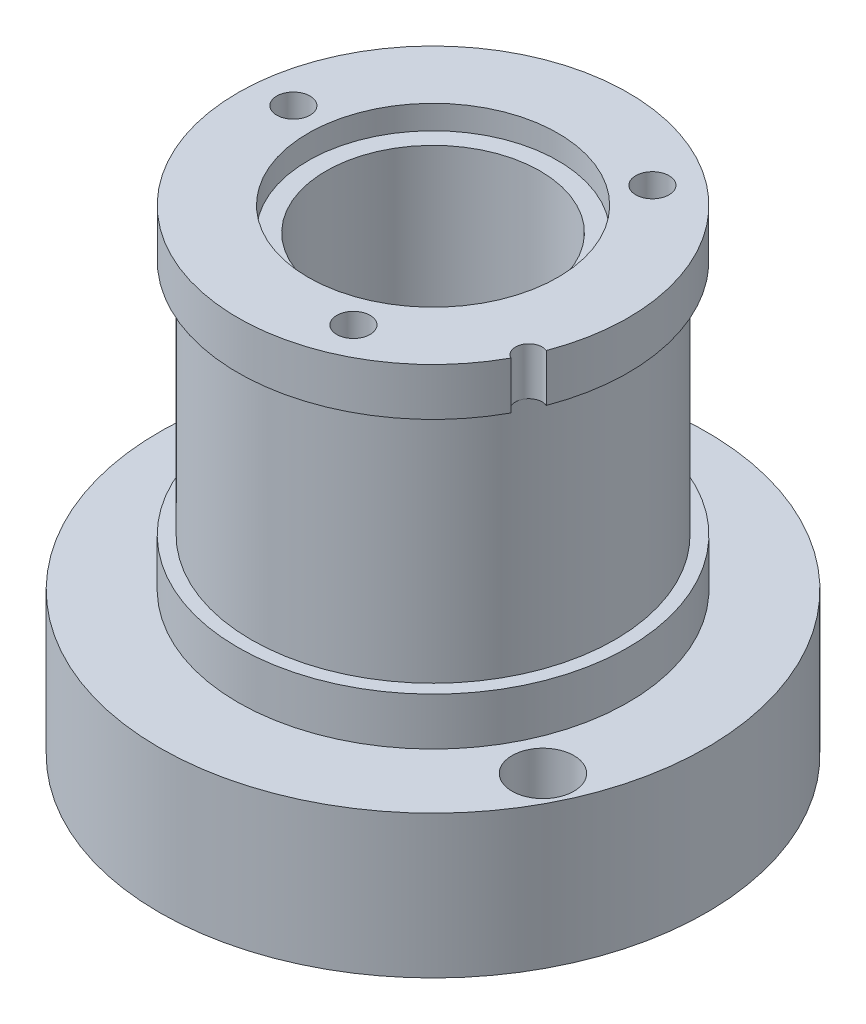
ISO-10303-21;
HEADER;
FILE_DESCRIPTION(('STEP AP214'),'2;1');
FILE_NAME('part.step','',(''),(''),'','','');
FILE_SCHEMA(('AUTOMOTIVE_DESIGN { 1 0 10303 214 1 1 1 1 }'));
ENDSEC;
DATA;
#1=APPLICATION_CONTEXT('core data for automotive mechanical design processes');
#2=APPLICATION_PROTOCOL_DEFINITION('international standard','automotive_design',2000,#1);
#3=PRODUCT_CONTEXT('',#1,'mechanical');
#4=PRODUCT('Part','Part','',(#3));
#5=PRODUCT_RELATED_PRODUCT_CATEGORY('part','',(#4));
#6=PRODUCT_DEFINITION_FORMATION('','',#4);
#7=PRODUCT_DEFINITION_CONTEXT('part definition',#1,'design');
#8=PRODUCT_DEFINITION('design','',#6,#7);
#9=PRODUCT_DEFINITION_SHAPE('','',#8);
#10=(LENGTH_UNIT() NAMED_UNIT(*) SI_UNIT(.MILLI.,.METRE.));
#11=(NAMED_UNIT(*) PLANE_ANGLE_UNIT() SI_UNIT($,.RADIAN.));
#12=(NAMED_UNIT(*) SI_UNIT($,.STERADIAN.) SOLID_ANGLE_UNIT());
#13=UNCERTAINTY_MEASURE_WITH_UNIT(LENGTH_MEASURE(1.E-05),#10,'distance_accuracy_value','');
#14=(GEOMETRIC_REPRESENTATION_CONTEXT(3) GLOBAL_UNCERTAINTY_ASSIGNED_CONTEXT((#13)) GLOBAL_UNIT_ASSIGNED_CONTEXT((#10,
#11,#12)) REPRESENTATION_CONTEXT('',''));
#15=CARTESIAN_POINT('',(0.,0.,0.));
#16=DIRECTION('',(0.,0.,1.));
#17=DIRECTION('',(1.,0.,0.));
#18=AXIS2_PLACEMENT_3D('',#15,#16,#17);
#19=CARTESIAN_POINT('',(13.0281539228037,7.62,14.3830452707903));
#20=DIRECTION('',(0.,1.,0.));
#21=DIRECTION('',(0.,0.,1.));
#22=AXIS2_PLACEMENT_3D('',#19,#20,#21);
#23=PLANE('',#22);
#24=CARTESIAN_POINT('',(13.0281539228037,7.62,14.3830452707903));
#25=DIRECTION('',(0.,1.,0.));
#26=DIRECTION('',(0.,0.,1.));
#27=AXIS2_PLACEMENT_3D('',#24,#25,#26);
#28=CIRCLE('',#27,14.605);
#29=CARTESIAN_POINT('',(13.0281539228037,7.62,28.9880452707903));
#30=VERTEX_POINT('',#29);
#31=EDGE_CURVE('E111',#30,#30,#28,.T.);
#32=ORIENTED_EDGE('',*,*,#31,.T.);
#33=EDGE_LOOP('',(#32));
#34=FACE_BOUND('',#33,.T.);
#35=CARTESIAN_POINT('',(1.60675446587194,7.62,8.82952076420888));
#36=DIRECTION('',(0.,1.,0.));
#37=DIRECTION('',(0.,0.,1.));
#38=AXIS2_PLACEMENT_3D('',#35,#36,#37);
#39=CIRCLE('',#38,1.651);
#40=CARTESIAN_POINT('',(1.60675446587194,7.62,7.17852076420888));
#41=VERTEX_POINT('',#40);
#42=EDGE_CURVE('E131',#41,#41,#39,.T.);
#43=ORIENTED_EDGE('',*,*,#42,.F.);
#44=EDGE_LOOP('',(#43));
#45=FACE_BOUND('',#44,.T.);
#46=CARTESIAN_POINT('',(24.4495533797354,7.62,19.9365697773716));
#47=DIRECTION('',(0.,1.,0.));
#48=DIRECTION('',(0.,0.,1.));
#49=AXIS2_PLACEMENT_3D('',#46,#47,#48);
#50=CIRCLE('',#49,1.651);
#51=CARTESIAN_POINT('',(24.4495533797354,7.62,18.2855697773716));
#52=VERTEX_POINT('',#51);
#53=EDGE_CURVE('E45',#52,#52,#50,.T.);
#54=ORIENTED_EDGE('',*,*,#53,.F.);
#55=EDGE_LOOP('',(#54));
#56=FACE_BOUND('',#55,.T.);
#57=CARTESIAN_POINT('',(13.0281539228037,7.62,14.3830452707903));
#58=DIRECTION('',(0.,1.,0.));
#59=DIRECTION('',(0.,0.,1.));
#60=AXIS2_PLACEMENT_3D('',#57,#58,#59);
#61=CIRCLE('',#60,10.414);
#62=CARTESIAN_POINT('',(13.0281539228037,7.62,24.7970452707903));
#63=VERTEX_POINT('',#62);
#64=EDGE_CURVE('E475',#63,#63,#61,.T.);
#65=ORIENTED_EDGE('',*,*,#64,.F.);
#66=EDGE_LOOP('',(#65));
#67=FACE_BOUND('',#66,.T.);
#68=ADVANCED_FACE('F41',(#34,#45,#56,#67),#23,.T.);
#69=CARTESIAN_POINT('',(13.0281539228037,25.4,14.3830452707903));
#70=DIRECTION('',(0.,-1.,0.));
#71=DIRECTION('',(0.,0.,-1.));
#72=AXIS2_PLACEMENT_3D('',#69,#70,#71);
#73=CYLINDRICAL_SURFACE('',#72,14.605);
#74=CARTESIAN_POINT('',(13.0281539228037,0.,14.3830452707903));
#75=DIRECTION('',(0.,1.,0.));
#76=DIRECTION('',(0.,0.,1.));
#77=AXIS2_PLACEMENT_3D('',#74,#75,#76);
#78=CIRCLE('',#77,14.605);
#79=CARTESIAN_POINT('',(13.0281539228037,0.,28.9880452707903));
#80=VERTEX_POINT('',#79);
#81=EDGE_CURVE('E12',#80,#80,#78,.T.);
#82=ORIENTED_EDGE('',*,*,#81,.T.);
#83=EDGE_LOOP('',(#82));
#84=FACE_BOUND('',#83,.T.);
#85=ORIENTED_EDGE('',*,*,#31,.F.);
#86=EDGE_LOOP('',(#85));
#87=FACE_BOUND('',#86,.T.);
#88=ADVANCED_FACE('F43',(#84,#87),#73,.T.);
#89=CARTESIAN_POINT('',(13.0281539228037,25.4,14.3830452707903));
#90=DIRECTION('',(0.,1.,0.));
#91=DIRECTION('',(0.,0.,1.));
#92=AXIS2_PLACEMENT_3D('',#89,#90,#91);
#93=PLANE('',#92);
#94=CARTESIAN_POINT('',(22.4903320136348,25.4,18.7325948770593));
#95=DIRECTION('',(0.,1.,0.));
#96=DIRECTION('',(0.,0.,1.));
#97=AXIS2_PLACEMENT_3D('',#94,#95,#96);
#98=CIRCLE('',#97,0.711199999999998);
#99=CARTESIAN_POINT('',(22.7651359221512,25.4,18.0766312714652));
#100=VERTEX_POINT('',#99);
#101=CARTESIAN_POINT('',(22.17139754222,25.4,19.3682726593857));
#102=VERTEX_POINT('',#101);
#103=EDGE_CURVE('E94',#100,#102,#98,.T.);
#104=ORIENTED_EDGE('',*,*,#103,.F.);
#105=CARTESIAN_POINT('',(13.0281539228037,25.4,14.3830452707903));
#106=DIRECTION('',(0.,1.,0.));
#107=DIRECTION('',(0.,0.,1.));
#108=AXIS2_PLACEMENT_3D('',#105,#106,#107);
#109=CIRCLE('',#108,10.414);
#110=EDGE_CURVE('E107',#100,#102,#109,.T.);
#111=ORIENTED_EDGE('',*,*,#110,.T.);
#112=EDGE_LOOP('',(#104,#111));
#113=FACE_BOUND('',#112,.T.);
#114=CARTESIAN_POINT('',(16.4348390463682,25.4,22.0415320971081));
#115=DIRECTION('',(0.,1.,0.));
#116=DIRECTION('',(0.,0.,1.));
#117=AXIS2_PLACEMENT_3D('',#114,#115,#116);
#118=CIRCLE('',#117,0.889000000000001);
#119=CARTESIAN_POINT('',(16.4348390463682,25.4,22.9305320971081));
#120=VERTEX_POINT('',#119);
#121=EDGE_CURVE('E157',#120,#120,#118,.T.);
#122=ORIENTED_EDGE('',*,*,#121,.F.);
#123=EDGE_LOOP('',(#122));
#124=FACE_BOUND('',#123,.T.);
#125=CARTESIAN_POINT('',(17.9572555071611,25.4,7.60352599792991));
#126=DIRECTION('',(0.,1.,0.));
#127=DIRECTION('',(0.,0.,1.));
#128=AXIS2_PLACEMENT_3D('',#125,#126,#127);
#129=CIRCLE('',#128,0.889000000000001);
#130=CARTESIAN_POINT('',(17.9572555071611,25.4,8.49252599792991));
#131=VERTEX_POINT('',#130);
#132=EDGE_CURVE('E163',#131,#131,#129,.T.);
#133=ORIENTED_EDGE('',*,*,#132,.F.);
#134=EDGE_LOOP('',(#133));
#135=FACE_BOUND('',#134,.T.);
#136=CARTESIAN_POINT('',(4.69236721488166,25.4,13.5040777173328));
#137=DIRECTION('',(0.,1.,0.));
#138=DIRECTION('',(0.,0.,1.));
#139=AXIS2_PLACEMENT_3D('',#136,#137,#138);
#140=CIRCLE('',#139,0.889);
#141=CARTESIAN_POINT('',(4.69236721488166,25.4,14.3930777173328));
#142=VERTEX_POINT('',#141);
#143=EDGE_CURVE('E118',#142,#142,#140,.T.);
#144=ORIENTED_EDGE('',*,*,#143,.F.);
#145=EDGE_LOOP('',(#144));
#146=FACE_BOUND('',#145,.T.);
#147=CARTESIAN_POINT('',(13.0281539228037,25.4,14.3830452707903));
#148=DIRECTION('',(0.,1.,0.));
#149=DIRECTION('',(0.,0.,1.));
#150=AXIS2_PLACEMENT_3D('',#147,#148,#149);
#151=CIRCLE('',#150,6.6675);
#152=CARTESIAN_POINT('',(13.0281539228037,25.4,21.0505452707903));
#153=VERTEX_POINT('',#152);
#154=EDGE_CURVE('E115',#153,#153,#151,.T.);
#155=ORIENTED_EDGE('',*,*,#154,.F.);
#156=EDGE_LOOP('',(#155));
#157=FACE_BOUND('',#156,.T.);
#158=ADVANCED_FACE('F105',(#113,#124,#135,#146,#157),#93,.T.);
#159=CARTESIAN_POINT('',(13.0281539228037,0.,14.3830452707903));
#160=DIRECTION('',(0.,1.,0.));
#161=DIRECTION('',(0.,0.,1.));
#162=AXIS2_PLACEMENT_3D('',#159,#160,#161);
#163=CYLINDRICAL_SURFACE('',#162,5.715);
#164=CARTESIAN_POINT('',(13.0281539228037,0.,14.3830452707903));
#165=DIRECTION('',(0.,1.,0.));
#166=DIRECTION('',(0.,0.,1.));
#167=AXIS2_PLACEMENT_3D('',#164,#165,#166);
#168=CIRCLE('',#167,5.715);
#169=CARTESIAN_POINT('',(13.0281539228037,0.,20.0980452707903));
#170=VERTEX_POINT('',#169);
#171=EDGE_CURVE('E50',#170,#170,#168,.T.);
#172=ORIENTED_EDGE('',*,*,#171,.F.);
#173=EDGE_LOOP('',(#172));
#174=FACE_BOUND('',#173,.T.);
#175=CARTESIAN_POINT('',(13.0281539228037,24.13,14.3830452707903));
#176=DIRECTION('',(0.,1.,0.));
#177=DIRECTION('',(0.,0.,1.));
#178=AXIS2_PLACEMENT_3D('',#175,#176,#177);
#179=CIRCLE('',#178,5.715);
#180=CARTESIAN_POINT('',(13.0281539228037,24.13,20.0980452707903));
#181=VERTEX_POINT('',#180);
#182=EDGE_CURVE('E125',#181,#181,#179,.F.);
#183=ORIENTED_EDGE('',*,*,#182,.F.);
#184=EDGE_LOOP('',(#183));
#185=FACE_BOUND('',#184,.T.);
#186=ADVANCED_FACE('F175',(#174,#185),#163,.F.);
#187=CARTESIAN_POINT('',(13.0281539228037,0.,14.3830452707903));
#188=DIRECTION('',(0.,1.,0.));
#189=DIRECTION('',(0.,0.,1.));
#190=AXIS2_PLACEMENT_3D('',#187,#188,#189);
#191=PLANE('',#190);
#192=CARTESIAN_POINT('',(5.82740256425499,0.,15.2376598659039));
#193=DIRECTION('',(0.,-1.,0.));
#194=DIRECTION('',(0.,0.,-1.));
#195=AXIS2_PLACEMENT_3D('',#192,#193,#194);
#196=CIRCLE('',#195,0.595629999999989);
#197=CARTESIAN_POINT('',(5.82740256425499,0.,14.6420298659039));
#198=VERTEX_POINT('',#197);
#199=EDGE_CURVE('E428',#198,#198,#196,.T.);
#200=ORIENTED_EDGE('',*,*,#199,.F.);
#201=EDGE_LOOP('',(#200));
#202=FACE_BOUND('',#201,.T.);
#203=CARTESIAN_POINT('',(5.82740256425499,0.,19.0476598659039));
#204=DIRECTION('',(0.,-1.,0.));
#205=DIRECTION('',(0.,0.,-1.));
#206=AXIS2_PLACEMENT_3D('',#203,#204,#205);
#207=CIRCLE('',#206,0.595629999999989);
#208=CARTESIAN_POINT('',(5.82740256425499,0.,18.4520298659039));
#209=VERTEX_POINT('',#208);
#210=EDGE_CURVE('E432',#209,#209,#207,.T.);
#211=ORIENTED_EDGE('',*,*,#210,.F.);
#212=EDGE_LOOP('',(#211));
#213=FACE_BOUND('',#212,.T.);
#214=CARTESIAN_POINT('',(5.82740256425499,0.,17.1426598659039));
#215=DIRECTION('',(0.,-1.,0.));
#216=DIRECTION('',(0.,0.,-1.));
#217=AXIS2_PLACEMENT_3D('',#214,#215,#216);
#218=CIRCLE('',#217,0.79375);
#219=CARTESIAN_POINT('',(5.82740256425499,0.,16.3489098659039));
#220=VERTEX_POINT('',#219);
#221=EDGE_CURVE('E436',#220,#220,#218,.T.);
#222=ORIENTED_EDGE('',*,*,#221,.F.);
#223=EDGE_LOOP('',(#222));
#224=FACE_BOUND('',#223,.T.);
#225=CARTESIAN_POINT('',(24.4495533797354,0.,19.9365697773716));
#226=DIRECTION('',(0.,-1.,0.));
#227=DIRECTION('',(0.,0.,1.));
#228=AXIS2_PLACEMENT_3D('',#225,#226,#227);
#229=CIRCLE('',#228,1.651);
#230=CARTESIAN_POINT('',(24.4495533797354,0.,18.2855697773716));
#231=VERTEX_POINT('',#230);
#232=EDGE_CURVE('E145',#231,#231,#229,.T.);
#233=ORIENTED_EDGE('',*,*,#232,.F.);
#234=EDGE_LOOP('',(#233));
#235=FACE_BOUND('',#234,.T.);
#236=CARTESIAN_POINT('',(1.60675446587194,0.,8.82952076420888));
#237=DIRECTION('',(0.,-1.,0.));
#238=DIRECTION('',(0.,0.,-1.));
#239=AXIS2_PLACEMENT_3D('',#236,#237,#238);
#240=CIRCLE('',#239,1.651);
#241=CARTESIAN_POINT('',(1.60675446587194,0.,7.17852076420888));
#242=VERTEX_POINT('',#241);
#243=EDGE_CURVE('E134',#242,#242,#240,.T.);
#244=ORIENTED_EDGE('',*,*,#243,.F.);
#245=EDGE_LOOP('',(#244));
#246=FACE_BOUND('',#245,.T.);
#247=CARTESIAN_POINT('',(17.8930413905689,0.,4.37789934651808));
#248=DIRECTION('',(0.,-1.,0.));
#249=DIRECTION('',(0.,0.,-1.));
#250=AXIS2_PLACEMENT_3D('',#247,#248,#249);
#251=CIRCLE('',#250,0.793749999999999);
#252=CARTESIAN_POINT('',(17.8930413905689,0.,3.58414934651808));
#253=VERTEX_POINT('',#252);
#254=EDGE_CURVE('E133',#253,#253,#251,.T.);
#255=ORIENTED_EDGE('',*,*,#254,.F.);
#256=EDGE_LOOP('',(#255));
#257=FACE_BOUND('',#256,.T.);
#258=CARTESIAN_POINT('',(8.16326645503836,0.,24.3881911950625));
#259=DIRECTION('',(0.,-1.,0.));
#260=DIRECTION('',(0.,0.,-1.));
#261=AXIS2_PLACEMENT_3D('',#258,#259,#260);
#262=CIRCLE('',#261,0.793749999999999);
#263=CARTESIAN_POINT('',(8.16326645503836,0.,23.5944411950625));
#264=VERTEX_POINT('',#263);
#265=EDGE_CURVE('E151',#264,#264,#262,.T.);
#266=ORIENTED_EDGE('',*,*,#265,.F.);
#267=EDGE_LOOP('',(#266));
#268=FACE_BOUND('',#267,.T.);
#269=ORIENTED_EDGE('',*,*,#171,.T.);
#270=EDGE_LOOP('',(#269));
#271=FACE_BOUND('',#270,.T.);
#272=ORIENTED_EDGE('',*,*,#81,.F.);
#273=EDGE_LOOP('',(#272));
#274=FACE_BOUND('',#273,.T.);
#275=ADVANCED_FACE('F190',(#202,#213,#224,#235,#246,#257,#268,#271,#274),#191,.F.);
#276=CARTESIAN_POINT('',(13.0281539228037,24.13,14.3830452707903));
#277=DIRECTION('',(0.,1.,0.));
#278=DIRECTION('',(0.,0.,1.));
#279=AXIS2_PLACEMENT_3D('',#276,#277,#278);
#280=PLANE('',#279);
#281=CARTESIAN_POINT('',(13.0281539228037,24.13,14.3830452707903));
#282=DIRECTION('',(0.,1.,0.));
#283=DIRECTION('',(0.,0.,1.));
#284=AXIS2_PLACEMENT_3D('',#281,#282,#283);
#285=CIRCLE('',#284,6.6675);
#286=CARTESIAN_POINT('',(13.0281539228037,24.13,21.0505452707903));
#287=VERTEX_POINT('',#286);
#288=EDGE_CURVE('E122',#287,#287,#285,.T.);
#289=ORIENTED_EDGE('',*,*,#288,.T.);
#290=EDGE_LOOP('',(#289));
#291=FACE_BOUND('',#290,.T.);
#292=ORIENTED_EDGE('',*,*,#182,.T.);
#293=EDGE_LOOP('',(#292));
#294=FACE_BOUND('',#293,.T.);
#295=ADVANCED_FACE('F181',(#291,#294),#280,.T.);
#296=CARTESIAN_POINT('',(13.0281539228037,24.13,14.3830452707903));
#297=DIRECTION('',(0.,1.,0.));
#298=DIRECTION('',(0.,0.,1.));
#299=AXIS2_PLACEMENT_3D('',#296,#297,#298);
#300=CYLINDRICAL_SURFACE('',#299,6.6675);
#301=ORIENTED_EDGE('',*,*,#288,.F.);
#302=EDGE_LOOP('',(#301));
#303=FACE_BOUND('',#302,.T.);
#304=ORIENTED_EDGE('',*,*,#154,.T.);
#305=EDGE_LOOP('',(#304));
#306=FACE_BOUND('',#305,.T.);
#307=ADVANCED_FACE('F179',(#303,#306),#300,.F.);
#308=CARTESIAN_POINT('',(13.0281539228037,7.62,14.3830452707903));
#309=DIRECTION('',(0.,1.,0.));
#310=DIRECTION('',(0.,0.,1.));
#311=AXIS2_PLACEMENT_3D('',#308,#309,#310);
#312=CYLINDRICAL_SURFACE('',#311,10.414);
#313=DIRECTION('',(0.,1.,0.));
#314=VECTOR('',#313,1.);
#315=CARTESIAN_POINT('',(22.7651359221512,23.622,18.0766312714652));
#316=LINE('',#315,#314);
#317=CARTESIAN_POINT('',(22.7651359221512,22.86,18.0766312714652));
#318=VERTEX_POINT('',#317);
#319=EDGE_CURVE('E91',#318,#100,#316,.T.);
#320=ORIENTED_EDGE('',*,*,#319,.F.);
#321=CARTESIAN_POINT('',(13.0281539228037,22.86,14.3830452707903));
#322=DIRECTION('',(0.,1.,0.));
#323=DIRECTION('',(0.,0.,1.));
#324=AXIS2_PLACEMENT_3D('',#321,#322,#323);
#325=CIRCLE('',#324,10.414);
#326=CARTESIAN_POINT('',(22.17139754222,22.86,19.3682726593857));
#327=VERTEX_POINT('',#326);
#328=EDGE_CURVE('E469',#318,#327,#325,.T.);
#329=ORIENTED_EDGE('',*,*,#328,.T.);
#330=DIRECTION('',(0.,1.,0.));
#331=VECTOR('',#330,1.);
#332=CARTESIAN_POINT('',(22.17139754222,23.622,19.3682726593857));
#333=LINE('',#332,#331);
#334=EDGE_CURVE('E58',#102,#327,#333,.F.);
#335=ORIENTED_EDGE('',*,*,#334,.F.);
#336=ORIENTED_EDGE('',*,*,#110,.F.);
#337=EDGE_LOOP('',(#320,#329,#335,#336));
#338=FACE_BOUND('',#337,.T.);
#339=ADVANCED_FACE('F110',(#338),#312,.T.);
#340=CARTESIAN_POINT('',(4.69236721488166,22.86,13.5040777173328));
#341=DIRECTION('',(0.,1.,0.));
#342=DIRECTION('',(0.,0.,1.));
#343=AXIS2_PLACEMENT_3D('',#340,#341,#342);
#344=CONICAL_SURFACE('',#343,0.888999999999999,1.02974425867665);
#345=CARTESIAN_POINT('',(4.69236721488166,22.3258349096845,13.5040777173328));
#346=VERTEX_POINT('',#345);
#347=VERTEX_LOOP('',#346);
#348=FACE_BOUND('',#347,.T.);
#349=CARTESIAN_POINT('',(4.69236721488166,22.86,13.5040777173328));
#350=DIRECTION('',(0.,1.,0.));
#351=DIRECTION('',(0.,0.,1.));
#352=AXIS2_PLACEMENT_3D('',#349,#350,#351);
#353=CIRCLE('',#352,0.888999999999999);
#354=CARTESIAN_POINT('',(4.69236721488166,22.86,14.3930777173328));
#355=VERTEX_POINT('',#354);
#356=EDGE_CURVE('E112',#355,#355,#353,.T.);
#357=ORIENTED_EDGE('',*,*,#356,.T.);
#358=EDGE_LOOP('',(#357));
#359=FACE_BOUND('',#358,.T.);
#360=ADVANCED_FACE('F188',(#348,#359),#344,.F.);
#361=CARTESIAN_POINT('',(4.69236721488166,25.4,13.5040777173328));
#362=DIRECTION('',(0.,1.,0.));
#363=DIRECTION('',(0.,0.,1.));
#364=AXIS2_PLACEMENT_3D('',#361,#362,#363);
#365=CYLINDRICAL_SURFACE('',#364,0.889);
#366=ORIENTED_EDGE('',*,*,#356,.F.);
#367=EDGE_LOOP('',(#366));
#368=FACE_BOUND('',#367,.T.);
#369=ORIENTED_EDGE('',*,*,#143,.T.);
#370=EDGE_LOOP('',(#369));
#371=FACE_BOUND('',#370,.T.);
#372=ADVANCED_FACE('F171',(#368,#371),#365,.F.);
#373=CARTESIAN_POINT('',(17.9572555071611,22.86,7.60352599792991));
#374=DIRECTION('',(0.,1.,0.));
#375=DIRECTION('',(0.,0.,1.));
#376=AXIS2_PLACEMENT_3D('',#373,#374,#375);
#377=CONICAL_SURFACE('',#376,0.889000000000001,1.02974425867665);
#378=CARTESIAN_POINT('',(17.9572555071611,22.3258349096845,7.60352599792991));
#379=VERTEX_POINT('',#378);
#380=VERTEX_LOOP('',#379);
#381=FACE_BOUND('',#380,.T.);
#382=CARTESIAN_POINT('',(17.9572555071611,22.86,7.60352599792991));
#383=DIRECTION('',(0.,1.,0.));
#384=DIRECTION('',(0.,0.,1.));
#385=AXIS2_PLACEMENT_3D('',#382,#383,#384);
#386=CIRCLE('',#385,0.889000000000001);
#387=CARTESIAN_POINT('',(17.9572555071611,22.86,8.49252599792991));
#388=VERTEX_POINT('',#387);
#389=EDGE_CURVE('E166',#388,#388,#386,.T.);
#390=ORIENTED_EDGE('',*,*,#389,.T.);
#391=EDGE_LOOP('',(#390));
#392=FACE_BOUND('',#391,.T.);
#393=ADVANCED_FACE('F208',(#381,#392),#377,.F.);
#394=CARTESIAN_POINT('',(17.9572555071611,25.4,7.60352599792991));
#395=DIRECTION('',(0.,1.,0.));
#396=DIRECTION('',(0.,0.,1.));
#397=AXIS2_PLACEMENT_3D('',#394,#395,#396);
#398=CYLINDRICAL_SURFACE('',#397,0.889000000000001);
#399=ORIENTED_EDGE('',*,*,#389,.F.);
#400=EDGE_LOOP('',(#399));
#401=FACE_BOUND('',#400,.T.);
#402=ORIENTED_EDGE('',*,*,#132,.T.);
#403=EDGE_LOOP('',(#402));
#404=FACE_BOUND('',#403,.T.);
#405=ADVANCED_FACE('F212',(#401,#404),#398,.F.);
#406=CARTESIAN_POINT('',(16.4348390463682,22.86,22.0415320971081));
#407=DIRECTION('',(0.,1.,0.));
#408=DIRECTION('',(0.,0.,1.));
#409=AXIS2_PLACEMENT_3D('',#406,#407,#408);
#410=CONICAL_SURFACE('',#409,0.889000000000001,1.02974425867665);
#411=CARTESIAN_POINT('',(16.4348390463682,22.3258349096845,22.0415320971081));
#412=VERTEX_POINT('',#411);
#413=VERTEX_LOOP('',#412);
#414=FACE_BOUND('',#413,.T.);
#415=CARTESIAN_POINT('',(16.4348390463682,22.86,22.0415320971081));
#416=DIRECTION('',(0.,1.,0.));
#417=DIRECTION('',(0.,0.,1.));
#418=AXIS2_PLACEMENT_3D('',#415,#416,#417);
#419=CIRCLE('',#418,0.889000000000001);
#420=CARTESIAN_POINT('',(16.4348390463682,22.86,22.9305320971081));
#421=VERTEX_POINT('',#420);
#422=EDGE_CURVE('E160',#421,#421,#419,.T.);
#423=ORIENTED_EDGE('',*,*,#422,.T.);
#424=EDGE_LOOP('',(#423));
#425=FACE_BOUND('',#424,.T.);
#426=ADVANCED_FACE('F216',(#414,#425),#410,.F.);
#427=CARTESIAN_POINT('',(16.4348390463682,25.4,22.0415320971081));
#428=DIRECTION('',(0.,1.,0.));
#429=DIRECTION('',(0.,0.,1.));
#430=AXIS2_PLACEMENT_3D('',#427,#428,#429);
#431=CYLINDRICAL_SURFACE('',#430,0.889000000000001);
#432=ORIENTED_EDGE('',*,*,#422,.F.);
#433=EDGE_LOOP('',(#432));
#434=FACE_BOUND('',#433,.T.);
#435=ORIENTED_EDGE('',*,*,#121,.T.);
#436=EDGE_LOOP('',(#435));
#437=FACE_BOUND('',#436,.T.);
#438=ADVANCED_FACE('F220',(#434,#437),#431,.F.);
#439=CARTESIAN_POINT('',(8.16326645503836,4.0005,24.3881911950625));
#440=DIRECTION('',(0.,-1.,0.));
#441=DIRECTION('',(0.,0.,-1.));
#442=AXIS2_PLACEMENT_3D('',#439,#440,#441);
#443=CONICAL_SURFACE('',#442,0.793749999999999,1.02974425867665);
#444=CARTESIAN_POINT('',(8.16326645503836,4.47743311635313,24.3881911950625));
#445=VERTEX_POINT('',#444);
#446=VERTEX_LOOP('',#445);
#447=FACE_BOUND('',#446,.T.);
#448=CARTESIAN_POINT('',(8.16326645503836,4.0005,24.3881911950625));
#449=DIRECTION('',(0.,-1.,0.));
#450=DIRECTION('',(0.,0.,-1.));
#451=AXIS2_PLACEMENT_3D('',#448,#449,#450);
#452=CIRCLE('',#451,0.793749999999999);
#453=CARTESIAN_POINT('',(8.16326645503836,4.0005,23.5944411950625));
#454=VERTEX_POINT('',#453);
#455=EDGE_CURVE('E154',#454,#454,#452,.T.);
#456=ORIENTED_EDGE('',*,*,#455,.T.);
#457=EDGE_LOOP('',(#456));
#458=FACE_BOUND('',#457,.T.);
#459=ADVANCED_FACE('F224',(#447,#458),#443,.F.);
#460=CARTESIAN_POINT('',(8.16326645503836,0.,24.3881911950625));
#461=DIRECTION('',(0.,-1.,0.));
#462=DIRECTION('',(0.,0.,-1.));
#463=AXIS2_PLACEMENT_3D('',#460,#461,#462);
#464=CYLINDRICAL_SURFACE('',#463,0.793749999999999);
#465=ORIENTED_EDGE('',*,*,#455,.F.);
#466=EDGE_LOOP('',(#465));
#467=FACE_BOUND('',#466,.T.);
#468=ORIENTED_EDGE('',*,*,#265,.T.);
#469=EDGE_LOOP('',(#468));
#470=FACE_BOUND('',#469,.T.);
#471=ADVANCED_FACE('F228',(#467,#470),#464,.F.);
#472=CARTESIAN_POINT('',(17.8930413905689,4.0005,4.37789934651808));
#473=DIRECTION('',(0.,-1.,0.));
#474=DIRECTION('',(0.,0.,-1.));
#475=AXIS2_PLACEMENT_3D('',#472,#473,#474);
#476=CONICAL_SURFACE('',#475,0.793749999999999,1.02974425867665);
#477=CARTESIAN_POINT('',(17.8930413905689,4.47743311635313,4.37789934651808));
#478=VERTEX_POINT('',#477);
#479=VERTEX_LOOP('',#478);
#480=FACE_BOUND('',#479,.T.);
#481=CARTESIAN_POINT('',(17.8930413905689,4.0005,4.37789934651808));
#482=DIRECTION('',(0.,-1.,0.));
#483=DIRECTION('',(0.,0.,-1.));
#484=AXIS2_PLACEMENT_3D('',#481,#482,#483);
#485=CIRCLE('',#484,0.793749999999999);
#486=CARTESIAN_POINT('',(17.8930413905689,4.0005,3.58414934651808));
#487=VERTEX_POINT('',#486);
#488=EDGE_CURVE('E138',#487,#487,#485,.T.);
#489=ORIENTED_EDGE('',*,*,#488,.T.);
#490=EDGE_LOOP('',(#489));
#491=FACE_BOUND('',#490,.T.);
#492=ADVANCED_FACE('F232',(#480,#491),#476,.F.);
#493=CARTESIAN_POINT('',(17.8930413905689,0.,4.37789934651808));
#494=DIRECTION('',(0.,-1.,0.));
#495=DIRECTION('',(0.,0.,-1.));
#496=AXIS2_PLACEMENT_3D('',#493,#494,#495);
#497=CYLINDRICAL_SURFACE('',#496,0.793749999999999);
#498=ORIENTED_EDGE('',*,*,#488,.F.);
#499=EDGE_LOOP('',(#498));
#500=FACE_BOUND('',#499,.T.);
#501=ORIENTED_EDGE('',*,*,#254,.T.);
#502=EDGE_LOOP('',(#501));
#503=FACE_BOUND('',#502,.T.);
#504=ADVANCED_FACE('F236',(#500,#503),#497,.F.);
#505=CARTESIAN_POINT('',(1.60675446587194,8.89,8.82952076420888));
#506=DIRECTION('',(0.,-1.,0.));
#507=DIRECTION('',(0.,0.,-1.));
#508=AXIS2_PLACEMENT_3D('',#505,#506,#507);
#509=CYLINDRICAL_SURFACE('',#508,1.651);
#510=CARTESIAN_POINT('',(1.60675446587194,7.62,7.17852076420888));
#511=CARTESIAN_POINT('',(1.60675446587194,7.540625,7.17852076420888));
#512=CARTESIAN_POINT('',(1.60675446587194,7.46125,7.17852076420888));
#513=CARTESIAN_POINT('',(1.60675446587194,7.3025,7.17852076420888));
#514=CARTESIAN_POINT('',(1.60675446587194,7.223125,7.17852076420888));
#515=CARTESIAN_POINT('',(1.60675446587194,7.064375,7.17852076420888));
#516=CARTESIAN_POINT('',(1.60675446587194,6.985,7.17852076420888));
#517=CARTESIAN_POINT('',(1.60675446587194,6.82625,7.17852076420888));
#518=CARTESIAN_POINT('',(1.60675446587194,6.746875,7.17852076420888));
#519=CARTESIAN_POINT('',(1.60675446587194,6.588125,7.17852076420888));
#520=CARTESIAN_POINT('',(1.60675446587194,6.50875,7.17852076420888));
#521=CARTESIAN_POINT('',(1.60675446587194,6.35,7.17852076420888));
#522=CARTESIAN_POINT('',(1.60675446587194,6.270625,7.17852076420888));
#523=CARTESIAN_POINT('',(1.60675446587194,6.111875,7.17852076420888));
#524=CARTESIAN_POINT('',(1.60675446587194,6.0325,7.17852076420888));
#525=CARTESIAN_POINT('',(1.60675446587194,5.87375,7.17852076420888));
#526=CARTESIAN_POINT('',(1.60675446587194,5.794375,7.17852076420888));
#527=CARTESIAN_POINT('',(1.60675446587194,5.635625,7.17852076420888));
#528=CARTESIAN_POINT('',(1.60675446587194,5.55625,7.17852076420888));
#529=CARTESIAN_POINT('',(1.60675446587194,5.3975,7.17852076420888));
#530=CARTESIAN_POINT('',(1.60675446587194,5.318125,7.17852076420888));
#531=CARTESIAN_POINT('',(1.60675446587194,5.159375,7.17852076420888));
#532=CARTESIAN_POINT('',(1.60675446587194,5.08,7.17852076420888));
#533=CARTESIAN_POINT('',(1.60675446587194,4.92125,7.17852076420888));
#534=CARTESIAN_POINT('',(1.60675446587194,4.841875,7.17852076420888));
#535=CARTESIAN_POINT('',(1.60675446587194,4.683125,7.17852076420888));
#536=CARTESIAN_POINT('',(1.60675446587194,4.60375,7.17852076420888));
#537=CARTESIAN_POINT('',(1.60675446587194,4.445,7.17852076420888));
#538=CARTESIAN_POINT('',(1.60675446587194,4.365625,7.17852076420888));
#539=CARTESIAN_POINT('',(1.60675446587194,4.206875,7.17852076420888));
#540=CARTESIAN_POINT('',(1.60675446587194,4.1275,7.17852076420888));
#541=CARTESIAN_POINT('',(1.60675446587194,3.96875,7.17852076420888));
#542=CARTESIAN_POINT('',(1.60675446587194,3.889375,7.17852076420888));
#543=CARTESIAN_POINT('',(1.60675446587194,3.730625,7.17852076420888));
#544=CARTESIAN_POINT('',(1.60675446587194,3.65125,7.17852076420888));
#545=CARTESIAN_POINT('',(1.60675446587194,3.4925,7.17852076420888));
#546=CARTESIAN_POINT('',(1.60675446587194,3.413125,7.17852076420888));
#547=CARTESIAN_POINT('',(1.60675446587194,3.254375,7.17852076420888));
#548=CARTESIAN_POINT('',(1.60675446587194,3.175,7.17852076420888));
#549=CARTESIAN_POINT('',(1.60675446587194,3.01625,7.17852076420888));
#550=CARTESIAN_POINT('',(1.60675446587194,2.936875,7.17852076420888));
#551=CARTESIAN_POINT('',(1.60675446587194,2.778125,7.17852076420888));
#552=CARTESIAN_POINT('',(1.60675446587194,2.69875,7.17852076420888));
#553=CARTESIAN_POINT('',(1.60675446587194,2.54,7.17852076420888));
#554=CARTESIAN_POINT('',(1.60675446587194,2.460625,7.17852076420888));
#555=CARTESIAN_POINT('',(1.60675446587194,2.301875,7.17852076420888));
#556=CARTESIAN_POINT('',(1.60675446587194,2.2225,7.17852076420888));
#557=CARTESIAN_POINT('',(1.60675446587194,2.06375,7.17852076420888));
#558=CARTESIAN_POINT('',(1.60675446587194,1.984375,7.17852076420888));
#559=CARTESIAN_POINT('',(1.60675446587194,1.825625,7.17852076420888));
#560=CARTESIAN_POINT('',(1.60675446587194,1.74625,7.17852076420888));
#561=CARTESIAN_POINT('',(1.60675446587194,1.5875,7.17852076420888));
#562=CARTESIAN_POINT('',(1.60675446587194,1.508125,7.17852076420888));
#563=CARTESIAN_POINT('',(1.60675446587194,1.349375,7.17852076420888));
#564=CARTESIAN_POINT('',(1.60675446587194,1.27,7.17852076420888));
#565=CARTESIAN_POINT('',(1.60675446587194,1.11125,7.17852076420888));
#566=CARTESIAN_POINT('',(1.60675446587194,1.031875,7.17852076420888));
#567=CARTESIAN_POINT('',(1.60675446587194,0.873125,7.17852076420888));
#568=CARTESIAN_POINT('',(1.60675446587194,0.79375,7.17852076420888));
#569=CARTESIAN_POINT('',(1.60675446587194,0.635,7.17852076420888));
#570=CARTESIAN_POINT('',(1.60675446587194,0.555625000000001,7.17852076420888));
#571=CARTESIAN_POINT('',(1.60675446587194,0.396875000000001,7.17852076420888));
#572=CARTESIAN_POINT('',(1.60675446587194,0.317500000000001,7.17852076420888));
#573=CARTESIAN_POINT('',(1.60675446587194,0.15875,7.17852076420888));
#574=CARTESIAN_POINT('',(1.60675446587194,0.0793750000000001,7.17852076420888));
#575=CARTESIAN_POINT('',(1.60675446587194,0.,7.17852076420888));
#576=B_SPLINE_CURVE_WITH_KNOTS('',3,(#510,#511,#512,#513,#514,#515,#516,#517,#518,#519,#520,
#521,#522,#523,#524,#525,#526,#527,#528,#529,#530,#531,#532,#533,#534,#535,#536,#537,#538,#539,
#540,#541,#542,#543,#544,#545,#546,#547,#548,#549,#550,#551,#552,#553,#554,#555,#556,#557,#558,
#559,#560,#561,#562,#563,#564,#565,#566,#567,#568,#569,#570,#571,#572,#573,#574,#575),
.UNSPECIFIED.,.F.,.F.,(4,2,2,2,2,2,2,2,2,2,2,2,2,2,2,2,2,2,2,2,2,2,2,2,2,2,2,2,2,2,2,2,4),(0.,
0.238125,0.47625,0.714375,0.952499999999999,1.190625,1.42875,1.666875,1.905,2.143125,2.38125,
2.619375,2.8575,3.095625,3.33375,3.571875,3.81,4.048125,4.28625,4.524375,4.7625,5.000625,
5.23875,5.476875,5.715,5.953125,6.19125,6.429375,6.6675,6.905625,7.14375,7.381875,7.62),.UNSPECIFIED.);
#577=EDGE_CURVE('BSEAM240',#41,#242,#576,.T.);
#578=ORIENTED_EDGE('',*,*,#42,.T.);
#579=ORIENTED_EDGE('',*,*,#243,.T.);
#580=ORIENTED_EDGE('',*,*,#577,.T.);
#581=ORIENTED_EDGE('',*,*,#577,.F.);
#582=EDGE_LOOP('',(#578,#580,#579,#581));
#583=FACE_BOUND('',#582,.T.);
#584=ADVANCED_FACE('F240',(#583),#509,.F.);
#585=CARTESIAN_POINT('',(24.4495533797354,8.89,19.9365697773716));
#586=DIRECTION('',(0.,-1.,0.));
#587=DIRECTION('',(0.,0.,-1.));
#588=AXIS2_PLACEMENT_3D('',#585,#586,#587);
#589=CYLINDRICAL_SURFACE('',#588,1.651);
#590=CARTESIAN_POINT('',(24.4495533797354,7.62,18.2855697773716));
#591=CARTESIAN_POINT('',(24.4495533797354,7.540625,18.2855697773716));
#592=CARTESIAN_POINT('',(24.4495533797354,7.46125,18.2855697773716));
#593=CARTESIAN_POINT('',(24.4495533797354,7.3025,18.2855697773716));
#594=CARTESIAN_POINT('',(24.4495533797354,7.223125,18.2855697773716));
#595=CARTESIAN_POINT('',(24.4495533797354,7.064375,18.2855697773716));
#596=CARTESIAN_POINT('',(24.4495533797354,6.985,18.2855697773716));
#597=CARTESIAN_POINT('',(24.4495533797354,6.82625,18.2855697773716));
#598=CARTESIAN_POINT('',(24.4495533797354,6.746875,18.2855697773716));
#599=CARTESIAN_POINT('',(24.4495533797354,6.588125,18.2855697773716));
#600=CARTESIAN_POINT('',(24.4495533797354,6.50875,18.2855697773716));
#601=CARTESIAN_POINT('',(24.4495533797354,6.35,18.2855697773716));
#602=CARTESIAN_POINT('',(24.4495533797354,6.270625,18.2855697773716));
#603=CARTESIAN_POINT('',(24.4495533797354,6.111875,18.2855697773716));
#604=CARTESIAN_POINT('',(24.4495533797354,6.0325,18.2855697773716));
#605=CARTESIAN_POINT('',(24.4495533797354,5.87375,18.2855697773716));
#606=CARTESIAN_POINT('',(24.4495533797354,5.794375,18.2855697773716));
#607=CARTESIAN_POINT('',(24.4495533797354,5.635625,18.2855697773716));
#608=CARTESIAN_POINT('',(24.4495533797354,5.55625,18.2855697773716));
#609=CARTESIAN_POINT('',(24.4495533797354,5.3975,18.2855697773716));
#610=CARTESIAN_POINT('',(24.4495533797354,5.318125,18.2855697773716));
#611=CARTESIAN_POINT('',(24.4495533797354,5.159375,18.2855697773716));
#612=CARTESIAN_POINT('',(24.4495533797354,5.08,18.2855697773716));
#613=CARTESIAN_POINT('',(24.4495533797354,4.92125,18.2855697773716));
#614=CARTESIAN_POINT('',(24.4495533797354,4.841875,18.2855697773716));
#615=CARTESIAN_POINT('',(24.4495533797354,4.683125,18.2855697773716));
#616=CARTESIAN_POINT('',(24.4495533797354,4.60375,18.2855697773716));
#617=CARTESIAN_POINT('',(24.4495533797354,4.445,18.2855697773716));
#618=CARTESIAN_POINT('',(24.4495533797354,4.365625,18.2855697773716));
#619=CARTESIAN_POINT('',(24.4495533797354,4.206875,18.2855697773716));
#620=CARTESIAN_POINT('',(24.4495533797354,4.1275,18.2855697773716));
#621=CARTESIAN_POINT('',(24.4495533797354,3.96875,18.2855697773716));
#622=CARTESIAN_POINT('',(24.4495533797354,3.889375,18.2855697773716));
#623=CARTESIAN_POINT('',(24.4495533797354,3.730625,18.2855697773716));
#624=CARTESIAN_POINT('',(24.4495533797354,3.65125,18.2855697773716));
#625=CARTESIAN_POINT('',(24.4495533797354,3.4925,18.2855697773716));
#626=CARTESIAN_POINT('',(24.4495533797354,3.413125,18.2855697773716));
#627=CARTESIAN_POINT('',(24.4495533797354,3.254375,18.2855697773716));
#628=CARTESIAN_POINT('',(24.4495533797354,3.175,18.2855697773716));
#629=CARTESIAN_POINT('',(24.4495533797354,3.01625,18.2855697773716));
#630=CARTESIAN_POINT('',(24.4495533797354,2.936875,18.2855697773716));
#631=CARTESIAN_POINT('',(24.4495533797354,2.778125,18.2855697773716));
#632=CARTESIAN_POINT('',(24.4495533797354,2.69875,18.2855697773716));
#633=CARTESIAN_POINT('',(24.4495533797354,2.54,18.2855697773716));
#634=CARTESIAN_POINT('',(24.4495533797354,2.460625,18.2855697773716));
#635=CARTESIAN_POINT('',(24.4495533797354,2.301875,18.2855697773716));
#636=CARTESIAN_POINT('',(24.4495533797354,2.2225,18.2855697773716));
#637=CARTESIAN_POINT('',(24.4495533797354,2.06375,18.2855697773716));
#638=CARTESIAN_POINT('',(24.4495533797354,1.984375,18.2855697773716));
#639=CARTESIAN_POINT('',(24.4495533797354,1.825625,18.2855697773716));
#640=CARTESIAN_POINT('',(24.4495533797354,1.74625,18.2855697773716));
#641=CARTESIAN_POINT('',(24.4495533797354,1.5875,18.2855697773716));
#642=CARTESIAN_POINT('',(24.4495533797354,1.508125,18.2855697773716));
#643=CARTESIAN_POINT('',(24.4495533797354,1.349375,18.2855697773716));
#644=CARTESIAN_POINT('',(24.4495533797354,1.27,18.2855697773716));
#645=CARTESIAN_POINT('',(24.4495533797354,1.11125,18.2855697773716));
#646=CARTESIAN_POINT('',(24.4495533797354,1.031875,18.2855697773716));
#647=CARTESIAN_POINT('',(24.4495533797354,0.873125,18.2855697773716));
#648=CARTESIAN_POINT('',(24.4495533797354,0.79375,18.2855697773716));
#649=CARTESIAN_POINT('',(24.4495533797354,0.635,18.2855697773716));
#650=CARTESIAN_POINT('',(24.4495533797354,0.555625000000001,18.2855697773716));
#651=CARTESIAN_POINT('',(24.4495533797354,0.396875000000001,18.2855697773716));
#652=CARTESIAN_POINT('',(24.4495533797354,0.317500000000001,18.2855697773716));
#653=CARTESIAN_POINT('',(24.4495533797354,0.15875,18.2855697773716));
#654=CARTESIAN_POINT('',(24.4495533797354,0.0793750000000001,18.2855697773716));
#655=CARTESIAN_POINT('',(24.4495533797354,0.,18.2855697773716));
#656=B_SPLINE_CURVE_WITH_KNOTS('',3,(#590,#591,#592,#593,#594,#595,#596,#597,#598,#599,#600,
#601,#602,#603,#604,#605,#606,#607,#608,#609,#610,#611,#612,#613,#614,#615,#616,#617,#618,#619,
#620,#621,#622,#623,#624,#625,#626,#627,#628,#629,#630,#631,#632,#633,#634,#635,#636,#637,#638,
#639,#640,#641,#642,#643,#644,#645,#646,#647,#648,#649,#650,#651,#652,#653,#654,#655),
.UNSPECIFIED.,.F.,.F.,(4,2,2,2,2,2,2,2,2,2,2,2,2,2,2,2,2,2,2,2,2,2,2,2,2,2,2,2,2,2,2,2,4),(0.,
0.238125,0.47625,0.714375,0.952499999999999,1.190625,1.42875,1.666875,1.905,2.143125,2.38125,
2.619375,2.8575,3.095625,3.33375,3.571875,3.81,4.048125,4.28625,4.524375,4.7625,5.000625,
5.23875,5.476875,5.715,5.953125,6.19125,6.429375,6.6675,6.905625,7.14375,7.381875,7.62),.UNSPECIFIED.);
#657=EDGE_CURVE('BSEAM244',#52,#231,#656,.T.);
#658=ORIENTED_EDGE('',*,*,#53,.T.);
#659=ORIENTED_EDGE('',*,*,#232,.T.);
#660=ORIENTED_EDGE('',*,*,#657,.T.);
#661=ORIENTED_EDGE('',*,*,#657,.F.);
#662=EDGE_LOOP('',(#658,#660,#659,#661));
#663=FACE_BOUND('',#662,.T.);
#664=ADVANCED_FACE('F244',(#663),#589,.F.);
#665=CARTESIAN_POINT('',(5.82740256425499,24.13,17.1426598659039));
#666=DIRECTION('',(0.,-1.,0.));
#667=DIRECTION('',(0.,0.,-1.));
#668=AXIS2_PLACEMENT_3D('',#665,#666,#667);
#669=CYLINDRICAL_SURFACE('',#668,0.79375);
#670=CARTESIAN_POINT('',(5.82740256425499,24.13,17.1426598659039));
#671=DIRECTION('',(0.,-1.,0.));
#672=DIRECTION('',(0.,0.,-1.));
#673=AXIS2_PLACEMENT_3D('',#670,#671,#672);
#674=CIRCLE('',#673,0.79375);
#675=CARTESIAN_POINT('',(5.82740256425499,24.13,16.3489098659039));
#676=VERTEX_POINT('',#675);
#677=EDGE_CURVE('E456',#676,#676,#674,.T.);
#678=CARTESIAN_POINT('',(5.82740256425499,24.13,16.3489098659039));
#679=CARTESIAN_POINT('',(5.82740256425499,23.8786458333333,16.3489098659039));
#680=CARTESIAN_POINT('',(5.82740256425499,23.6272916666667,16.3489098659039));
#681=CARTESIAN_POINT('',(5.82740256425499,23.1245833333333,16.3489098659039));
#682=CARTESIAN_POINT('',(5.82740256425499,22.8732291666667,16.3489098659039));
#683=CARTESIAN_POINT('',(5.82740256425499,22.3705208333333,16.3489098659039));
#684=CARTESIAN_POINT('',(5.82740256425499,22.1191666666667,16.3489098659039));
#685=CARTESIAN_POINT('',(5.82740256425499,21.6164583333333,16.3489098659039));
#686=CARTESIAN_POINT('',(5.82740256425499,21.3651041666667,16.3489098659039));
#687=CARTESIAN_POINT('',(5.82740256425499,20.8623958333333,16.3489098659039));
#688=CARTESIAN_POINT('',(5.82740256425499,20.6110416666667,16.3489098659039));
#689=CARTESIAN_POINT('',(5.82740256425499,20.1083333333333,16.3489098659039));
#690=CARTESIAN_POINT('',(5.82740256425499,19.8569791666667,16.3489098659039));
#691=CARTESIAN_POINT('',(5.82740256425499,19.3542708333333,16.3489098659039));
#692=CARTESIAN_POINT('',(5.82740256425499,19.1029166666667,16.3489098659039));
#693=CARTESIAN_POINT('',(5.82740256425499,18.6002083333333,16.3489098659039));
#694=CARTESIAN_POINT('',(5.82740256425499,18.3488541666667,16.3489098659039));
#695=CARTESIAN_POINT('',(5.82740256425499,17.8461458333333,16.3489098659039));
#696=CARTESIAN_POINT('',(5.82740256425499,17.5947916666667,16.3489098659039));
#697=CARTESIAN_POINT('',(5.82740256425499,17.0920833333333,16.3489098659039));
#698=CARTESIAN_POINT('',(5.82740256425499,16.8407291666667,16.3489098659039));
#699=CARTESIAN_POINT('',(5.82740256425499,16.3380208333333,16.3489098659039));
#700=CARTESIAN_POINT('',(5.82740256425499,16.0866666666667,16.3489098659039));
#701=CARTESIAN_POINT('',(5.82740256425499,15.5839583333333,16.3489098659039));
#702=CARTESIAN_POINT('',(5.82740256425499,15.3326041666667,16.3489098659039));
#703=CARTESIAN_POINT('',(5.82740256425499,14.8298958333333,16.3489098659039));
#704=CARTESIAN_POINT('',(5.82740256425499,14.5785416666667,16.3489098659039));
#705=CARTESIAN_POINT('',(5.82740256425499,14.0758333333333,16.3489098659039));
#706=CARTESIAN_POINT('',(5.82740256425499,13.8244791666667,16.3489098659039));
#707=CARTESIAN_POINT('',(5.82740256425499,13.3217708333333,16.3489098659039));
#708=CARTESIAN_POINT('',(5.82740256425499,13.0704166666667,16.3489098659039));
#709=CARTESIAN_POINT('',(5.82740256425499,12.5677083333333,16.3489098659039));
#710=CARTESIAN_POINT('',(5.82740256425499,12.3163541666667,16.3489098659039));
#711=CARTESIAN_POINT('',(5.82740256425499,11.8136458333333,16.3489098659039));
#712=CARTESIAN_POINT('',(5.82740256425499,11.5622916666667,16.3489098659039));
#713=CARTESIAN_POINT('',(5.82740256425499,11.0595833333333,16.3489098659039));
#714=CARTESIAN_POINT('',(5.82740256425499,10.8082291666667,16.3489098659039));
#715=CARTESIAN_POINT('',(5.82740256425499,10.3055208333333,16.3489098659039));
#716=CARTESIAN_POINT('',(5.82740256425499,10.0541666666667,16.3489098659039));
#717=CARTESIAN_POINT('',(5.82740256425499,9.55145833333333,16.3489098659039));
#718=CARTESIAN_POINT('',(5.82740256425499,9.30010416666667,16.3489098659039));
#719=CARTESIAN_POINT('',(5.82740256425499,8.79739583333334,16.3489098659039));
#720=CARTESIAN_POINT('',(5.82740256425499,8.54604166666667,16.3489098659039));
#721=CARTESIAN_POINT('',(5.82740256425499,8.04333333333334,16.3489098659039));
#722=CARTESIAN_POINT('',(5.82740256425499,7.79197916666667,16.3489098659039));
#723=CARTESIAN_POINT('',(5.82740256425499,7.28927083333334,16.3489098659039));
#724=CARTESIAN_POINT('',(5.82740256425499,7.03791666666667,16.3489098659039));
#725=CARTESIAN_POINT('',(5.82740256425499,6.53520833333334,16.3489098659039));
#726=CARTESIAN_POINT('',(5.82740256425499,6.28385416666667,16.3489098659039));
#727=CARTESIAN_POINT('',(5.82740256425499,5.78114583333334,16.3489098659039));
#728=CARTESIAN_POINT('',(5.82740256425499,5.52979166666667,16.3489098659039));
#729=CARTESIAN_POINT('',(5.82740256425499,5.02708333333334,16.3489098659039));
#730=CARTESIAN_POINT('',(5.82740256425499,4.77572916666667,16.3489098659039));
#731=CARTESIAN_POINT('',(5.82740256425499,4.27302083333334,16.3489098659039));
#732=CARTESIAN_POINT('',(5.82740256425499,4.02166666666667,16.3489098659039));
#733=CARTESIAN_POINT('',(5.82740256425499,3.51895833333334,16.3489098659039));
#734=CARTESIAN_POINT('',(5.82740256425499,3.26760416666667,16.3489098659039));
#735=CARTESIAN_POINT('',(5.82740256425499,2.76489583333334,16.3489098659039));
#736=CARTESIAN_POINT('',(5.82740256425499,2.51354166666667,16.3489098659039));
#737=CARTESIAN_POINT('',(5.82740256425499,2.01083333333334,16.3489098659039));
#738=CARTESIAN_POINT('',(5.82740256425499,1.75947916666667,16.3489098659039));
#739=CARTESIAN_POINT('',(5.82740256425499,1.25677083333334,16.3489098659039));
#740=CARTESIAN_POINT('',(5.82740256425499,1.00541666666667,16.3489098659039));
#741=CARTESIAN_POINT('',(5.82740256425499,0.502708333333336,16.3489098659039));
#742=CARTESIAN_POINT('',(5.82740256425499,0.25135416666667,16.3489098659039));
#743=CARTESIAN_POINT('',(5.82740256425499,0.,16.3489098659039));
#744=B_SPLINE_CURVE_WITH_KNOTS('',3,(#678,#679,#680,#681,#682,#683,#684,#685,#686,#687,#688,
#689,#690,#691,#692,#693,#694,#695,#696,#697,#698,#699,#700,#701,#702,#703,#704,#705,#706,#707,
#708,#709,#710,#711,#712,#713,#714,#715,#716,#717,#718,#719,#720,#721,#722,#723,#724,#725,#726,
#727,#728,#729,#730,#731,#732,#733,#734,#735,#736,#737,#738,#739,#740,#741,#742,#743),
.UNSPECIFIED.,.F.,.F.,(4,2,2,2,2,2,2,2,2,2,2,2,2,2,2,2,2,2,2,2,2,2,2,2,2,2,2,2,2,2,2,2,4),(0.,
0.754062500000003,1.508125,2.2621875,3.01625,3.7703125,4.524375,5.2784375,6.0325,6.7865625,
7.540625,8.2946875,9.04875,9.8028125,10.556875,11.3109375,12.065,12.8190625,13.573125,
14.3271875,15.08125,15.8353125,16.589375,17.3434375,18.0975,18.8515625,19.605625,20.3596875,
21.11375,21.8678125,22.621875,23.3759375,24.13),.UNSPECIFIED.);
#745=EDGE_CURVE('BSEAM247',#676,#220,#744,.T.);
#746=ORIENTED_EDGE('',*,*,#677,.F.);
#747=ORIENTED_EDGE('',*,*,#221,.T.);
#748=ORIENTED_EDGE('',*,*,#745,.T.);
#749=ORIENTED_EDGE('',*,*,#745,.F.);
#750=EDGE_LOOP('',(#746,#748,#747,#749));
#751=FACE_BOUND('',#750,.T.);
#752=ADVANCED_FACE('F247',(#751),#669,.F.);
#753=CARTESIAN_POINT('',(5.82740256425499,24.13,17.1426598659039));
#754=DIRECTION('',(0.,-1.,0.));
#755=DIRECTION('',(0.,0.,-1.));
#756=AXIS2_PLACEMENT_3D('',#753,#754,#755);
#757=PLANE('',#756);
#758=ORIENTED_EDGE('',*,*,#677,.T.);
#759=EDGE_LOOP('',(#758));
#760=FACE_BOUND('',#759,.T.);
#761=ADVANCED_FACE('F251',(#760),#757,.T.);
#762=CARTESIAN_POINT('',(5.82740256425499,6.34999999999999,19.0476598659039));
#763=DIRECTION('',(0.,-1.,0.));
#764=DIRECTION('',(0.,0.,-1.));
#765=AXIS2_PLACEMENT_3D('',#762,#763,#764);
#766=CONICAL_SURFACE('',#765,0.595629999999988,0.872664625997148);
#767=CARTESIAN_POINT('',(5.82740256425499,6.84979291331812,19.0476598659039));
#768=VERTEX_POINT('',#767);
#769=VERTEX_LOOP('',#768);
#770=FACE_BOUND('',#769,.T.);
#771=CARTESIAN_POINT('',(5.82740256425499,6.34999999999999,19.0476598659039));
#772=DIRECTION('',(0.,-1.,0.));
#773=DIRECTION('',(0.,0.,-1.));
#774=AXIS2_PLACEMENT_3D('',#771,#772,#773);
#775=CIRCLE('',#774,0.595629999999988);
#776=CARTESIAN_POINT('',(5.82740256425499,6.34999999999999,18.4520298659039));
#777=VERTEX_POINT('',#776);
#778=EDGE_CURVE('E460',#777,#777,#775,.T.);
#779=ORIENTED_EDGE('',*,*,#778,.T.);
#780=EDGE_LOOP('',(#779));
#781=FACE_BOUND('',#780,.T.);
#782=ADVANCED_FACE('F255',(#770,#781),#766,.F.);
#783=CARTESIAN_POINT('',(5.82740256425499,0.,19.0476598659039));
#784=DIRECTION('',(0.,-1.,0.));
#785=DIRECTION('',(0.,0.,-1.));
#786=AXIS2_PLACEMENT_3D('',#783,#784,#785);
#787=CYLINDRICAL_SURFACE('',#786,0.595629999999988);
#788=ORIENTED_EDGE('',*,*,#778,.F.);
#789=EDGE_LOOP('',(#788));
#790=FACE_BOUND('',#789,.T.);
#791=ORIENTED_EDGE('',*,*,#210,.T.);
#792=EDGE_LOOP('',(#791));
#793=FACE_BOUND('',#792,.T.);
#794=ADVANCED_FACE('F259',(#790,#793),#787,.F.);
#795=CARTESIAN_POINT('',(5.82740256425499,6.34999999999999,15.2376598659039));
#796=DIRECTION('',(0.,-1.,0.));
#797=DIRECTION('',(0.,0.,-1.));
#798=AXIS2_PLACEMENT_3D('',#795,#796,#797);
#799=CONICAL_SURFACE('',#798,0.595629999999988,0.872664625997148);
#800=CARTESIAN_POINT('',(5.82740256425499,6.84979291331812,15.2376598659039));
#801=VERTEX_POINT('',#800);
#802=VERTEX_LOOP('',#801);
#803=FACE_BOUND('',#802,.T.);
#804=CARTESIAN_POINT('',(5.82740256425499,6.34999999999999,15.2376598659039));
#805=DIRECTION('',(0.,-1.,0.));
#806=DIRECTION('',(0.,0.,-1.));
#807=AXIS2_PLACEMENT_3D('',#804,#805,#806);
#808=CIRCLE('',#807,0.595629999999988);
#809=CARTESIAN_POINT('',(5.82740256425499,6.34999999999999,14.6420298659039));
#810=VERTEX_POINT('',#809);
#811=EDGE_CURVE('E465',#810,#810,#808,.T.);
#812=ORIENTED_EDGE('',*,*,#811,.T.);
#813=EDGE_LOOP('',(#812));
#814=FACE_BOUND('',#813,.T.);
#815=ADVANCED_FACE('F263',(#803,#814),#799,.F.);
#816=CARTESIAN_POINT('',(5.82740256425499,0.,15.2376598659039));
#817=DIRECTION('',(0.,-1.,0.));
#818=DIRECTION('',(0.,0.,-1.));
#819=AXIS2_PLACEMENT_3D('',#816,#817,#818);
#820=CYLINDRICAL_SURFACE('',#819,0.595629999999988);
#821=ORIENTED_EDGE('',*,*,#811,.F.);
#822=EDGE_LOOP('',(#821));
#823=FACE_BOUND('',#822,.T.);
#824=ORIENTED_EDGE('',*,*,#199,.T.);
#825=EDGE_LOOP('',(#824));
#826=FACE_BOUND('',#825,.T.);
#827=ADVANCED_FACE('F267',(#823,#826),#820,.F.);
#828=CARTESIAN_POINT('',(13.0281539228037,22.86,14.3830452707903));
#829=DIRECTION('',(0.,1.,0.));
#830=DIRECTION('',(0.,0.,1.));
#831=AXIS2_PLACEMENT_3D('',#828,#829,#830);
#832=PLANE('',#831);
#833=ORIENTED_EDGE('',*,*,#328,.F.);
#834=CARTESIAN_POINT('',(22.4903320136348,22.86,18.7325948770593));
#835=DIRECTION('',(0.,1.,0.));
#836=DIRECTION('',(0.,0.,1.));
#837=AXIS2_PLACEMENT_3D('',#834,#835,#836);
#838=CIRCLE('',#837,0.711199999999998);
#839=CARTESIAN_POINT('',(21.8441344854805,22.86,18.4355524649239));
#840=VERTEX_POINT('',#839);
#841=EDGE_CURVE('E96',#318,#840,#838,.T.);
#842=ORIENTED_EDGE('',*,*,#841,.T.);
#843=CARTESIAN_POINT('',(13.0281539228037,22.86,14.3830452707903));
#844=DIRECTION('',(0.,1.,0.));
#845=DIRECTION('',(0.,0.,1.));
#846=AXIS2_PLACEMENT_3D('',#843,#844,#845);
#847=CIRCLE('',#846,9.7028);
#848=EDGE_CURVE('E471',#840,#840,#847,.T.);
#849=ORIENTED_EDGE('',*,*,#848,.T.);
#850=EDGE_CURVE('E108',#840,#327,#838,.T.);
#851=ORIENTED_EDGE('',*,*,#850,.T.);
#852=EDGE_LOOP('',(#833,#842,#849,#851));
#853=FACE_BOUND('',#852,.T.);
#854=ADVANCED_FACE('F271',(#853),#832,.F.);
#855=CARTESIAN_POINT('',(13.0281539228037,22.86,14.3830452707903));
#856=DIRECTION('',(0.,-1.,0.));
#857=DIRECTION('',(0.,0.,-1.));
#858=AXIS2_PLACEMENT_3D('',#855,#856,#857);
#859=CYLINDRICAL_SURFACE('',#858,9.7028);
#860=ORIENTED_EDGE('',*,*,#848,.F.);
#861=EDGE_LOOP('',(#860));
#862=FACE_BOUND('',#861,.T.);
#863=CARTESIAN_POINT('',(13.0281539228037,10.16,14.3830452707903));
#864=DIRECTION('',(0.,1.,0.));
#865=DIRECTION('',(0.,0.,1.));
#866=AXIS2_PLACEMENT_3D('',#863,#864,#865);
#867=CIRCLE('',#866,9.7028);
#868=CARTESIAN_POINT('',(13.0281539228037,10.16,24.0858452707903));
#869=VERTEX_POINT('',#868);
#870=EDGE_CURVE('E101',#869,#869,#867,.T.);
#871=ORIENTED_EDGE('',*,*,#870,.T.);
#872=EDGE_LOOP('',(#871));
#873=FACE_BOUND('',#872,.T.);
#874=ADVANCED_FACE('F275',(#862,#873),#859,.T.);
#875=CARTESIAN_POINT('',(13.0281539228037,10.16,14.3830452707903));
#876=DIRECTION('',(0.,1.,0.));
#877=DIRECTION('',(0.,0.,1.));
#878=AXIS2_PLACEMENT_3D('',#875,#876,#877);
#879=PLANE('',#878);
#880=CARTESIAN_POINT('',(13.0281539228037,10.16,14.3830452707903));
#881=DIRECTION('',(0.,1.,0.));
#882=DIRECTION('',(0.,0.,1.));
#883=AXIS2_PLACEMENT_3D('',#880,#881,#882);
#884=CIRCLE('',#883,10.414);
#885=CARTESIAN_POINT('',(13.0281539228037,10.16,24.7970452707903));
#886=VERTEX_POINT('',#885);
#887=EDGE_CURVE('E474',#886,#886,#884,.T.);
#888=ORIENTED_EDGE('',*,*,#887,.T.);
#889=EDGE_LOOP('',(#888));
#890=FACE_BOUND('',#889,.T.);
#891=ORIENTED_EDGE('',*,*,#870,.F.);
#892=EDGE_LOOP('',(#891));
#893=FACE_BOUND('',#892,.T.);
#894=ADVANCED_FACE('F279',(#890,#893),#879,.T.);
#895=CARTESIAN_POINT('',(13.0281539228037,10.16,14.3830452707903));
#896=DIRECTION('',(0.,-1.,0.));
#897=DIRECTION('',(0.,0.,-1.));
#898=AXIS2_PLACEMENT_3D('',#895,#896,#897);
#899=CYLINDRICAL_SURFACE('',#898,10.414);
#900=ORIENTED_EDGE('',*,*,#887,.F.);
#901=EDGE_LOOP('',(#900));
#902=FACE_BOUND('',#901,.T.);
#903=ORIENTED_EDGE('',*,*,#64,.T.);
#904=EDGE_LOOP('',(#903));
#905=FACE_BOUND('',#904,.T.);
#906=ADVANCED_FACE('F281',(#902,#905),#899,.T.);
#907=CARTESIAN_POINT('',(22.4903320136348,21.844,18.7325948770593));
#908=DIRECTION('',(0.,1.,0.));
#909=DIRECTION('',(0.,0.,1.));
#910=AXIS2_PLACEMENT_3D('',#907,#908,#909);
#911=CYLINDRICAL_SURFACE('',#910,0.711199999999998);
#912=ORIENTED_EDGE('',*,*,#319,.T.);
#913=ORIENTED_EDGE('',*,*,#103,.T.);
#914=ORIENTED_EDGE('',*,*,#334,.T.);
#915=ORIENTED_EDGE('',*,*,#850,.F.);
#916=ORIENTED_EDGE('',*,*,#841,.F.);
#917=EDGE_LOOP('',(#912,#913,#914,#915,#916));
#918=FACE_BOUND('',#917,.T.);
#919=ADVANCED_FACE('F93',(#918),#911,.F.);
#920=CLOSED_SHELL('',(#68,#88,#158,#186,#275,#295,#307,#339,#360,#372,#393,#405,#426,#438,#459,
#471,#492,#504,#584,#664,#752,#761,#782,#794,#815,#827,#854,#874,#894,#906,#919));
#921=MANIFOLD_SOLID_BREP('B2',#920);
#922=ADVANCED_BREP_SHAPE_REPRESENTATION('',(#18,#921),#14);
#923=SHAPE_DEFINITION_REPRESENTATION(#9,#922);
ENDSEC;
END-ISO-10303-21;
